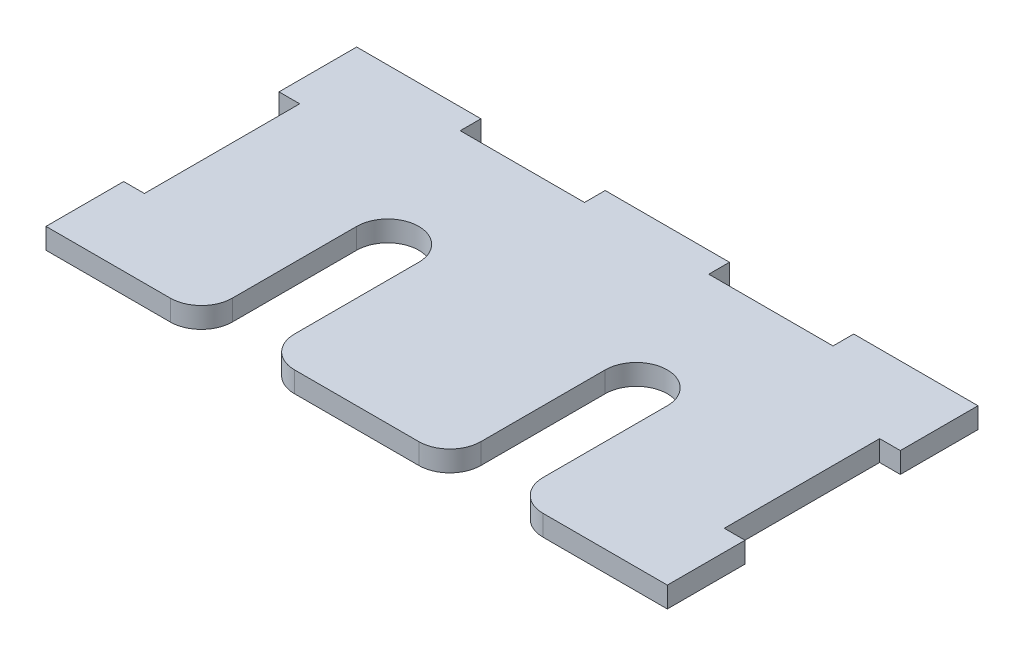
ISO-10303-21;
HEADER;
FILE_DESCRIPTION(('STEP AP214'),'2;1');
FILE_NAME('part.step','',(''),(''),'','','');
FILE_SCHEMA(('AUTOMOTIVE_DESIGN { 1 0 10303 214 1 1 1 1 }'));
ENDSEC;
DATA;
#1=APPLICATION_CONTEXT('core data for automotive mechanical design processes');
#2=APPLICATION_PROTOCOL_DEFINITION('international standard','automotive_design',2000,#1);
#3=PRODUCT_CONTEXT('',#1,'mechanical');
#4=PRODUCT('Part','Part','',(#3));
#5=PRODUCT_RELATED_PRODUCT_CATEGORY('part','',(#4));
#6=PRODUCT_DEFINITION_FORMATION('','',#4);
#7=PRODUCT_DEFINITION_CONTEXT('part definition',#1,'design');
#8=PRODUCT_DEFINITION('design','',#6,#7);
#9=PRODUCT_DEFINITION_SHAPE('','',#8);
#10=(LENGTH_UNIT() NAMED_UNIT(*) SI_UNIT(.MILLI.,.METRE.));
#11=(NAMED_UNIT(*) PLANE_ANGLE_UNIT() SI_UNIT($,.RADIAN.));
#12=(NAMED_UNIT(*) SI_UNIT($,.STERADIAN.) SOLID_ANGLE_UNIT());
#13=UNCERTAINTY_MEASURE_WITH_UNIT(LENGTH_MEASURE(1.E-05),#10,'distance_accuracy_value','');
#14=(GEOMETRIC_REPRESENTATION_CONTEXT(3) GLOBAL_UNCERTAINTY_ASSIGNED_CONTEXT((#13)) GLOBAL_UNIT_ASSIGNED_CONTEXT((#10,
#11,#12)) REPRESENTATION_CONTEXT('',''));
#15=CARTESIAN_POINT('',(0.,0.,0.));
#16=DIRECTION('',(0.,0.,1.));
#17=DIRECTION('',(1.,0.,0.));
#18=AXIS2_PLACEMENT_3D('',#15,#16,#17);
#19=CARTESIAN_POINT('',(45.,3.,22.5));
#20=DIRECTION('',(-1.,0.,0.));
#21=DIRECTION('',(0.,0.,1.));
#22=AXIS2_PLACEMENT_3D('',#19,#20,#21);
#23=PLANE('',#22);
#24=DIRECTION('',(0.,0.,-1.));
#25=VECTOR('',#24,1.);
#26=CARTESIAN_POINT('',(45.,0.,22.5));
#27=LINE('',#26,#25);
#28=CARTESIAN_POINT('',(45.,0.,22.5));
#29=VERTEX_POINT('',#28);
#30=CARTESIAN_POINT('',(45.,0.,11.25));
#31=VERTEX_POINT('',#30);
#32=EDGE_CURVE('E414',#29,#31,#27,.T.);
#33=ORIENTED_EDGE('',*,*,#32,.T.);
#34=DIRECTION('',(0.,1.,0.));
#35=VECTOR('',#34,1.);
#36=CARTESIAN_POINT('',(45.,0.,11.25));
#37=LINE('',#36,#35);
#38=CARTESIAN_POINT('',(45.,3.,11.25));
#39=VERTEX_POINT('',#38);
#40=EDGE_CURVE('E291',#31,#39,#37,.T.);
#41=ORIENTED_EDGE('',*,*,#40,.T.);
#42=DIRECTION('',(0.,0.,-1.));
#43=VECTOR('',#42,1.);
#44=CARTESIAN_POINT('',(45.,3.,22.5));
#45=LINE('',#44,#43);
#46=CARTESIAN_POINT('',(45.,3.,22.5));
#47=VERTEX_POINT('',#46);
#48=EDGE_CURVE('E395',#47,#39,#45,.T.);
#49=ORIENTED_EDGE('',*,*,#48,.F.);
#50=DIRECTION('',(0.,-1.,0.));
#51=VECTOR('',#50,1.);
#52=CARTESIAN_POINT('',(45.,3.,22.5));
#53=LINE('',#52,#51);
#54=EDGE_CURVE('E412',#47,#29,#53,.T.);
#55=ORIENTED_EDGE('',*,*,#54,.T.);
#56=EDGE_LOOP('',(#33,#41,#49,#55));
#57=FACE_BOUND('',#56,.T.);
#58=ADVANCED_FACE('F33',(#57),#23,.F.);
#59=CARTESIAN_POINT('',(-45.,3.,-22.5));
#60=DIRECTION('',(0.,0.,1.));
#61=DIRECTION('',(1.,0.,0.));
#62=AXIS2_PLACEMENT_3D('',#59,#60,#61);
#63=PLANE('',#62);
#64=DIRECTION('',(-1.,0.,0.));
#65=VECTOR('',#64,1.);
#66=CARTESIAN_POINT('',(-45.,3.,-22.5));
#67=LINE('',#66,#65);
#68=CARTESIAN_POINT('',(-27.,3.,-22.5));
#69=VERTEX_POINT('',#68);
#70=CARTESIAN_POINT('',(-45.,3.,-22.5));
#71=VERTEX_POINT('',#70);
#72=EDGE_CURVE('E398',#69,#71,#67,.T.);
#73=ORIENTED_EDGE('',*,*,#72,.F.);
#74=DIRECTION('',(0.,1.,0.));
#75=VECTOR('',#74,1.);
#76=CARTESIAN_POINT('',(-27.,0.,-22.5));
#77=LINE('',#76,#75);
#78=CARTESIAN_POINT('',(-27.,0.,-22.5));
#79=VERTEX_POINT('',#78);
#80=EDGE_CURVE('E271',#79,#69,#77,.T.);
#81=ORIENTED_EDGE('',*,*,#80,.F.);
#82=DIRECTION('',(-1.,0.,0.));
#83=VECTOR('',#82,1.);
#84=CARTESIAN_POINT('',(-45.,0.,-22.5));
#85=LINE('',#84,#83);
#86=CARTESIAN_POINT('',(-45.,0.,-22.5));
#87=VERTEX_POINT('',#86);
#88=EDGE_CURVE('E261',#79,#87,#85,.T.);
#89=ORIENTED_EDGE('',*,*,#88,.T.);
#90=DIRECTION('',(0.,-1.,0.));
#91=VECTOR('',#90,1.);
#92=CARTESIAN_POINT('',(-45.,3.,-22.5));
#93=LINE('',#92,#91);
#94=EDGE_CURVE('E435',#71,#87,#93,.T.);
#95=ORIENTED_EDGE('',*,*,#94,.F.);
#96=EDGE_LOOP('',(#73,#81,#89,#95));
#97=FACE_BOUND('',#96,.T.);
#98=ADVANCED_FACE('F554',(#97),#63,.F.);
#99=CARTESIAN_POINT('',(9.00000000000002,0.,-22.5));
#100=VERTEX_POINT('',#99);
#101=CARTESIAN_POINT('',(-8.99999999999998,0.,-22.5));
#102=VERTEX_POINT('',#101);
#103=EDGE_CURVE('E421',#100,#102,#85,.T.);
#104=ORIENTED_EDGE('',*,*,#103,.T.);
#105=DIRECTION('',(0.,1.,0.));
#106=VECTOR('',#105,1.);
#107=CARTESIAN_POINT('',(-8.99999999999998,0.,-22.5));
#108=LINE('',#107,#106);
#109=CARTESIAN_POINT('',(-8.99999999999998,3.,-22.5));
#110=VERTEX_POINT('',#109);
#111=EDGE_CURVE('E274',#102,#110,#108,.T.);
#112=ORIENTED_EDGE('',*,*,#111,.T.);
#113=CARTESIAN_POINT('',(9.00000000000002,3.,-22.5));
#114=VERTEX_POINT('',#113);
#115=EDGE_CURVE('E404',#114,#110,#67,.T.);
#116=ORIENTED_EDGE('',*,*,#115,.F.);
#117=DIRECTION('',(0.,1.,0.));
#118=VECTOR('',#117,1.);
#119=CARTESIAN_POINT('',(9.00000000000002,0.,-22.5));
#120=LINE('',#119,#118);
#121=EDGE_CURVE('E269',#100,#114,#120,.T.);
#122=ORIENTED_EDGE('',*,*,#121,.F.);
#123=EDGE_LOOP('',(#104,#112,#116,#122));
#124=FACE_BOUND('',#123,.T.);
#125=ADVANCED_FACE('F559',(#124),#63,.F.);
#126=CARTESIAN_POINT('',(-45.,3.,22.5));
#127=DIRECTION('',(1.,0.,0.));
#128=DIRECTION('',(0.,0.,-1.));
#129=AXIS2_PLACEMENT_3D('',#126,#127,#128);
#130=PLANE('',#129);
#131=DIRECTION('',(0.,0.,1.));
#132=VECTOR('',#131,1.);
#133=CARTESIAN_POINT('',(-45.,0.,22.5));
#134=LINE('',#133,#132);
#135=CARTESIAN_POINT('',(-45.,0.,-11.25));
#136=VERTEX_POINT('',#135);
#137=EDGE_CURVE('E422',#87,#136,#134,.T.);
#138=ORIENTED_EDGE('',*,*,#137,.T.);
#139=DIRECTION('',(0.,1.,0.));
#140=VECTOR('',#139,1.);
#141=CARTESIAN_POINT('',(-45.,0.,-11.25));
#142=LINE('',#141,#140);
#143=CARTESIAN_POINT('',(-45.,3.,-11.25));
#144=VERTEX_POINT('',#143);
#145=EDGE_CURVE('E344',#136,#144,#142,.T.);
#146=ORIENTED_EDGE('',*,*,#145,.T.);
#147=DIRECTION('',(0.,0.,1.));
#148=VECTOR('',#147,1.);
#149=CARTESIAN_POINT('',(-45.,3.,22.5));
#150=LINE('',#149,#148);
#151=EDGE_CURVE('E405',#71,#144,#150,.T.);
#152=ORIENTED_EDGE('',*,*,#151,.F.);
#153=ORIENTED_EDGE('',*,*,#94,.T.);
#154=EDGE_LOOP('',(#138,#146,#152,#153));
#155=FACE_BOUND('',#154,.T.);
#156=ADVANCED_FACE('F549',(#155),#130,.F.);
#157=CARTESIAN_POINT('',(-45.,3.,22.5));
#158=DIRECTION('',(0.,0.,-1.));
#159=DIRECTION('',(-1.,0.,0.));
#160=AXIS2_PLACEMENT_3D('',#157,#158,#159);
#161=PLANE('',#160);
#162=DIRECTION('',(1.,0.,0.));
#163=VECTOR('',#162,1.);
#164=CARTESIAN_POINT('',(-45.,3.,22.5));
#165=LINE('',#164,#163);
#166=CARTESIAN_POINT('',(-8.99999999999999,3.,22.5));
#167=VERTEX_POINT('',#166);
#168=CARTESIAN_POINT('',(9.00000000000001,3.,22.5));
#169=VERTEX_POINT('',#168);
#170=EDGE_CURVE('E413',#167,#169,#165,.T.);
#171=ORIENTED_EDGE('',*,*,#170,.F.);
#172=DIRECTION('',(0.,1.,0.));
#173=VECTOR('',#172,1.);
#174=CARTESIAN_POINT('',(-8.99999999999997,3.,22.5));
#175=LINE('',#174,#173);
#176=CARTESIAN_POINT('',(-8.99999999999999,0.,22.5));
#177=VERTEX_POINT('',#176);
#178=EDGE_CURVE('E468',#167,#177,#175,.F.);
#179=ORIENTED_EDGE('',*,*,#178,.T.);
#180=DIRECTION('',(1.,0.,0.));
#181=VECTOR('',#180,1.);
#182=CARTESIAN_POINT('',(-45.,0.,22.5));
#183=LINE('',#182,#181);
#184=CARTESIAN_POINT('',(9.00000000000001,0.,22.5));
#185=VERTEX_POINT('',#184);
#186=EDGE_CURVE('E429',#177,#185,#183,.T.);
#187=ORIENTED_EDGE('',*,*,#186,.T.);
#188=DIRECTION('',(0.,1.,0.));
#189=VECTOR('',#188,1.);
#190=CARTESIAN_POINT('',(9.00000000000002,3.,22.5));
#191=LINE('',#190,#189);
#192=EDGE_CURVE('E465',#185,#169,#191,.T.);
#193=ORIENTED_EDGE('',*,*,#192,.T.);
#194=EDGE_LOOP('',(#171,#179,#187,#193));
#195=FACE_BOUND('',#194,.T.);
#196=ADVANCED_FACE('F502',(#195),#161,.F.);
#197=CARTESIAN_POINT('',(-45.,0.,22.5));
#198=VERTEX_POINT('',#197);
#199=CARTESIAN_POINT('',(-27.,0.,22.5));
#200=VERTEX_POINT('',#199);
#201=EDGE_CURVE('E426',#198,#200,#183,.T.);
#202=ORIENTED_EDGE('',*,*,#201,.T.);
#203=DIRECTION('',(0.,1.,0.));
#204=VECTOR('',#203,1.);
#205=CARTESIAN_POINT('',(-27.,3.,22.5));
#206=LINE('',#205,#204);
#207=CARTESIAN_POINT('',(-27.,3.,22.5));
#208=VERTEX_POINT('',#207);
#209=EDGE_CURVE('E441',#200,#208,#206,.T.);
#210=ORIENTED_EDGE('',*,*,#209,.T.);
#211=CARTESIAN_POINT('',(-45.,3.,22.5));
#212=VERTEX_POINT('',#211);
#213=EDGE_CURVE('E409',#212,#208,#165,.T.);
#214=ORIENTED_EDGE('',*,*,#213,.F.);
#215=DIRECTION('',(0.,-1.,0.));
#216=VECTOR('',#215,1.);
#217=CARTESIAN_POINT('',(-45.,3.,22.5));
#218=LINE('',#217,#216);
#219=EDGE_CURVE('E432',#212,#198,#218,.T.);
#220=ORIENTED_EDGE('',*,*,#219,.T.);
#221=EDGE_LOOP('',(#202,#210,#214,#220));
#222=FACE_BOUND('',#221,.T.);
#223=ADVANCED_FACE('F530',(#222),#161,.F.);
#224=CARTESIAN_POINT('',(45.,3.,-11.25));
#225=VERTEX_POINT('',#224);
#226=CARTESIAN_POINT('',(45.,3.,-22.5));
#227=VERTEX_POINT('',#226);
#228=EDGE_CURVE('E399',#225,#227,#45,.T.);
#229=ORIENTED_EDGE('',*,*,#228,.F.);
#230=DIRECTION('',(0.,1.,0.));
#231=VECTOR('',#230,1.);
#232=CARTESIAN_POINT('',(45.,0.,-11.25));
#233=LINE('',#232,#231);
#234=CARTESIAN_POINT('',(45.,0.,-11.25));
#235=VERTEX_POINT('',#234);
#236=EDGE_CURVE('E312',#235,#225,#233,.T.);
#237=ORIENTED_EDGE('',*,*,#236,.F.);
#238=CARTESIAN_POINT('',(45.,0.,-22.5));
#239=VERTEX_POINT('',#238);
#240=EDGE_CURVE('E392',#235,#239,#27,.T.);
#241=ORIENTED_EDGE('',*,*,#240,.T.);
#242=DIRECTION('',(0.,-1.,0.));
#243=VECTOR('',#242,1.);
#244=CARTESIAN_POINT('',(45.,3.,-22.5));
#245=LINE('',#244,#243);
#246=EDGE_CURVE('E438',#227,#239,#245,.T.);
#247=ORIENTED_EDGE('',*,*,#246,.F.);
#248=EDGE_LOOP('',(#229,#237,#241,#247));
#249=FACE_BOUND('',#248,.T.);
#250=ADVANCED_FACE('F581',(#249),#23,.F.);
#251=CARTESIAN_POINT('',(27.,0.,-22.5));
#252=VERTEX_POINT('',#251);
#253=EDGE_CURVE('E417',#239,#252,#85,.T.);
#254=ORIENTED_EDGE('',*,*,#253,.T.);
#255=DIRECTION('',(0.,1.,0.));
#256=VECTOR('',#255,1.);
#257=CARTESIAN_POINT('',(27.,0.,-22.5));
#258=LINE('',#257,#256);
#259=CARTESIAN_POINT('',(27.,3.,-22.5));
#260=VERTEX_POINT('',#259);
#261=EDGE_CURVE('E296',#252,#260,#258,.T.);
#262=ORIENTED_EDGE('',*,*,#261,.T.);
#263=EDGE_CURVE('E400',#227,#260,#67,.T.);
#264=ORIENTED_EDGE('',*,*,#263,.F.);
#265=ORIENTED_EDGE('',*,*,#246,.T.);
#266=EDGE_LOOP('',(#254,#262,#264,#265));
#267=FACE_BOUND('',#266,.T.);
#268=ADVANCED_FACE('F573',(#267),#63,.F.);
#269=CARTESIAN_POINT('',(-45.,3.,11.25));
#270=VERTEX_POINT('',#269);
#271=EDGE_CURVE('E403',#270,#212,#150,.T.);
#272=ORIENTED_EDGE('',*,*,#271,.F.);
#273=DIRECTION('',(0.,1.,0.));
#274=VECTOR('',#273,1.);
#275=CARTESIAN_POINT('',(-45.,0.,11.25));
#276=LINE('',#275,#274);
#277=CARTESIAN_POINT('',(-45.,0.,11.25));
#278=VERTEX_POINT('',#277);
#279=EDGE_CURVE('E337',#278,#270,#276,.T.);
#280=ORIENTED_EDGE('',*,*,#279,.F.);
#281=EDGE_CURVE('E420',#278,#198,#134,.T.);
#282=ORIENTED_EDGE('',*,*,#281,.T.);
#283=ORIENTED_EDGE('',*,*,#219,.F.);
#284=EDGE_LOOP('',(#272,#280,#282,#283));
#285=FACE_BOUND('',#284,.T.);
#286=ADVANCED_FACE('F535',(#285),#130,.F.);
#287=CARTESIAN_POINT('',(27.,3.,22.5));
#288=VERTEX_POINT('',#287);
#289=EDGE_CURVE('E408',#288,#47,#165,.T.);
#290=ORIENTED_EDGE('',*,*,#289,.F.);
#291=DIRECTION('',(0.,1.,0.));
#292=VECTOR('',#291,1.);
#293=CARTESIAN_POINT('',(27.,3.,22.5));
#294=LINE('',#293,#292);
#295=CARTESIAN_POINT('',(27.,0.,22.5));
#296=VERTEX_POINT('',#295);
#297=EDGE_CURVE('E11',#288,#296,#294,.F.);
#298=ORIENTED_EDGE('',*,*,#297,.T.);
#299=EDGE_CURVE('E425',#296,#29,#183,.T.);
#300=ORIENTED_EDGE('',*,*,#299,.T.);
#301=ORIENTED_EDGE('',*,*,#54,.F.);
#302=EDGE_LOOP('',(#290,#298,#300,#301));
#303=FACE_BOUND('',#302,.T.);
#304=ADVANCED_FACE('F494',(#303),#161,.F.);
#305=CARTESIAN_POINT('',(0.,3.,0.));
#306=DIRECTION('',(0.,-1.,0.));
#307=DIRECTION('',(0.,0.,-1.));
#308=AXIS2_PLACEMENT_3D('',#305,#306,#307);
#309=PLANE('',#308);
#310=DIRECTION('',(1.,0.,0.));
#311=VECTOR('',#310,1.);
#312=CARTESIAN_POINT('',(-27.,3.,-19.5));
#313=LINE('',#312,#311);
#314=CARTESIAN_POINT('',(-27.,3.,-19.5));
#315=VERTEX_POINT('',#314);
#316=CARTESIAN_POINT('',(-8.99999999999998,3.,-19.5));
#317=VERTEX_POINT('',#316);
#318=EDGE_CURVE('E264',#315,#317,#313,.T.);
#319=ORIENTED_EDGE('',*,*,#318,.F.);
#320=DIRECTION('',(0.,0.,1.));
#321=VECTOR('',#320,1.);
#322=CARTESIAN_POINT('',(-27.,3.,-22.5));
#323=LINE('',#322,#321);
#324=EDGE_CURVE('E247',#69,#315,#323,.T.);
#325=ORIENTED_EDGE('',*,*,#324,.F.);
#326=ORIENTED_EDGE('',*,*,#72,.T.);
#327=ORIENTED_EDGE('',*,*,#151,.T.);
#328=DIRECTION('',(-1.,0.,0.));
#329=VECTOR('',#328,1.);
#330=CARTESIAN_POINT('',(-45.,3.,-11.25));
#331=LINE('',#330,#329);
#332=CARTESIAN_POINT('',(-42.,3.,-11.25));
#333=VERTEX_POINT('',#332);
#334=EDGE_CURVE('E331',#333,#144,#331,.T.);
#335=ORIENTED_EDGE('',*,*,#334,.F.);
#336=DIRECTION('',(0.,0.,-1.));
#337=VECTOR('',#336,1.);
#338=CARTESIAN_POINT('',(-42.,3.,-11.25));
#339=LINE('',#338,#337);
#340=CARTESIAN_POINT('',(-42.,3.,11.25));
#341=VERTEX_POINT('',#340);
#342=EDGE_CURVE('E340',#341,#333,#339,.T.);
#343=ORIENTED_EDGE('',*,*,#342,.F.);
#344=DIRECTION('',(1.,0.,0.));
#345=VECTOR('',#344,1.);
#346=CARTESIAN_POINT('',(-45.,3.,11.25));
#347=LINE('',#346,#345);
#348=EDGE_CURVE('E273',#270,#341,#347,.T.);
#349=ORIENTED_EDGE('',*,*,#348,.F.);
#350=ORIENTED_EDGE('',*,*,#271,.T.);
#351=ORIENTED_EDGE('',*,*,#213,.T.);
#352=CARTESIAN_POINT('',(-27.,3.,18.));
#353=DIRECTION('',(0.,-1.,0.));
#354=DIRECTION('',(0.,0.,-1.));
#355=AXIS2_PLACEMENT_3D('',#352,#353,#354);
#356=CIRCLE('',#355,4.5);
#357=CARTESIAN_POINT('',(-22.5,3.,18.));
#358=VERTEX_POINT('',#357);
#359=EDGE_CURVE('E450',#208,#358,#356,.F.);
#360=ORIENTED_EDGE('',*,*,#359,.T.);
#361=DIRECTION('',(0.,0.,1.));
#362=VECTOR('',#361,1.);
#363=CARTESIAN_POINT('',(-22.5,3.,22.5));
#364=LINE('',#363,#362);
#365=CARTESIAN_POINT('',(-22.5,3.,0.));
#366=VERTEX_POINT('',#365);
#367=EDGE_CURVE('E371',#366,#358,#364,.T.);
#368=ORIENTED_EDGE('',*,*,#367,.F.);
#369=CARTESIAN_POINT('',(-18.,3.,0.));
#370=DIRECTION('',(0.,1.,0.));
#371=DIRECTION('',(0.,0.,-1.));
#372=AXIS2_PLACEMENT_3D('',#369,#370,#371);
#373=CIRCLE('',#372,4.5);
#374=CARTESIAN_POINT('',(-13.5,3.,0.));
#375=VERTEX_POINT('',#374);
#376=EDGE_CURVE('E378',#375,#366,#373,.T.);
#377=ORIENTED_EDGE('',*,*,#376,.F.);
#378=DIRECTION('',(0.,0.,-1.));
#379=VECTOR('',#378,1.);
#380=CARTESIAN_POINT('',(-13.5,3.,22.5));
#381=LINE('',#380,#379);
#382=CARTESIAN_POINT('',(-13.5,3.,18.));
#383=VERTEX_POINT('',#382);
#384=EDGE_CURVE('E386',#383,#375,#381,.T.);
#385=ORIENTED_EDGE('',*,*,#384,.F.);
#386=CARTESIAN_POINT('',(-8.99999999999997,3.,18.));
#387=DIRECTION('',(0.,-1.,0.));
#388=DIRECTION('',(0.,0.,-1.));
#389=AXIS2_PLACEMENT_3D('',#386,#387,#388);
#390=CIRCLE('',#389,4.5);
#391=EDGE_CURVE('E448',#383,#167,#390,.F.);
#392=ORIENTED_EDGE('',*,*,#391,.T.);
#393=ORIENTED_EDGE('',*,*,#170,.T.);
#394=CARTESIAN_POINT('',(9.00000000000002,3.,18.));
#395=DIRECTION('',(0.,-1.,0.));
#396=DIRECTION('',(0.,0.,-1.));
#397=AXIS2_PLACEMENT_3D('',#394,#395,#396);
#398=CIRCLE('',#397,4.5);
#399=CARTESIAN_POINT('',(13.5,3.,18.));
#400=VERTEX_POINT('',#399);
#401=EDGE_CURVE('E446',#169,#400,#398,.F.);
#402=ORIENTED_EDGE('',*,*,#401,.T.);
#403=DIRECTION('',(0.,0.,1.));
#404=VECTOR('',#403,1.);
#405=CARTESIAN_POINT('',(13.5,3.,22.5));
#406=LINE('',#405,#404);
#407=CARTESIAN_POINT('',(13.5,3.,0.));
#408=VERTEX_POINT('',#407);
#409=EDGE_CURVE('E347',#408,#400,#406,.T.);
#410=ORIENTED_EDGE('',*,*,#409,.F.);
#411=CARTESIAN_POINT('',(18.,3.,0.));
#412=DIRECTION('',(0.,1.,0.));
#413=DIRECTION('',(0.,0.,-1.));
#414=AXIS2_PLACEMENT_3D('',#411,#412,#413);
#415=CIRCLE('',#414,4.5);
#416=CARTESIAN_POINT('',(22.5,3.,0.));
#417=VERTEX_POINT('',#416);
#418=EDGE_CURVE('E357',#417,#408,#415,.T.);
#419=ORIENTED_EDGE('',*,*,#418,.F.);
#420=DIRECTION('',(0.,0.,-1.));
#421=VECTOR('',#420,1.);
#422=CARTESIAN_POINT('',(22.5,3.,22.5));
#423=LINE('',#422,#421);
#424=CARTESIAN_POINT('',(22.5,3.,18.));
#425=VERTEX_POINT('',#424);
#426=EDGE_CURVE('E365',#425,#417,#423,.T.);
#427=ORIENTED_EDGE('',*,*,#426,.F.);
#428=CARTESIAN_POINT('',(27.,3.,18.));
#429=DIRECTION('',(0.,-1.,0.));
#430=DIRECTION('',(0.,0.,-1.));
#431=AXIS2_PLACEMENT_3D('',#428,#429,#430);
#432=CIRCLE('',#431,4.5);
#433=EDGE_CURVE('E444',#425,#288,#432,.F.);
#434=ORIENTED_EDGE('',*,*,#433,.T.);
#435=ORIENTED_EDGE('',*,*,#289,.T.);
#436=ORIENTED_EDGE('',*,*,#48,.T.);
#437=DIRECTION('',(1.,0.,0.));
#438=VECTOR('',#437,1.);
#439=CARTESIAN_POINT('',(45.,3.,11.25));
#440=LINE('',#439,#438);
#441=CARTESIAN_POINT('',(42.,3.,11.25));
#442=VERTEX_POINT('',#441);
#443=EDGE_CURVE('E306',#442,#39,#440,.T.);
#444=ORIENTED_EDGE('',*,*,#443,.F.);
#445=DIRECTION('',(0.,0.,1.));
#446=VECTOR('',#445,1.);
#447=CARTESIAN_POINT('',(42.,3.,-11.25));
#448=LINE('',#447,#446);
#449=CARTESIAN_POINT('',(42.,3.,-11.25));
#450=VERTEX_POINT('',#449);
#451=EDGE_CURVE('E316',#450,#442,#448,.T.);
#452=ORIENTED_EDGE('',*,*,#451,.F.);
#453=DIRECTION('',(-1.,0.,0.));
#454=VECTOR('',#453,1.);
#455=CARTESIAN_POINT('',(45.,3.,-11.25));
#456=LINE('',#455,#454);
#457=EDGE_CURVE('E313',#225,#450,#456,.T.);
#458=ORIENTED_EDGE('',*,*,#457,.F.);
#459=ORIENTED_EDGE('',*,*,#228,.T.);
#460=ORIENTED_EDGE('',*,*,#263,.T.);
#461=DIRECTION('',(0.,0.,-1.));
#462=VECTOR('',#461,1.);
#463=CARTESIAN_POINT('',(27.,3.,-22.5));
#464=LINE('',#463,#462);
#465=CARTESIAN_POINT('',(27.,3.,-19.5));
#466=VERTEX_POINT('',#465);
#467=EDGE_CURVE('E282',#466,#260,#464,.T.);
#468=ORIENTED_EDGE('',*,*,#467,.F.);
#469=DIRECTION('',(1.,0.,0.));
#470=VECTOR('',#469,1.);
#471=CARTESIAN_POINT('',(9.00000000000002,3.,-19.5));
#472=LINE('',#471,#470);
#473=CARTESIAN_POINT('',(9.00000000000002,3.,-19.5));
#474=VERTEX_POINT('',#473);
#475=EDGE_CURVE('E290',#474,#466,#472,.T.);
#476=ORIENTED_EDGE('',*,*,#475,.F.);
#477=DIRECTION('',(0.,0.,1.));
#478=VECTOR('',#477,1.);
#479=CARTESIAN_POINT('',(9.00000000000002,3.,-22.5));
#480=LINE('',#479,#478);
#481=EDGE_CURVE('E287',#114,#474,#480,.T.);
#482=ORIENTED_EDGE('',*,*,#481,.F.);
#483=ORIENTED_EDGE('',*,*,#115,.T.);
#484=DIRECTION('',(0.,0.,-1.));
#485=VECTOR('',#484,1.);
#486=CARTESIAN_POINT('',(-8.99999999999998,3.,-22.5));
#487=LINE('',#486,#485);
#488=EDGE_CURVE('E262',#317,#110,#487,.T.);
#489=ORIENTED_EDGE('',*,*,#488,.F.);
#490=EDGE_LOOP('',(#319,#325,#326,#327,#335,#343,#349,#350,#351,#360,#368,#377,#385,#392,#393,
#402,#410,#419,#427,#434,#435,#436,#444,#452,#458,#459,#460,#468,#476,#482,#483,#489));
#491=FACE_BOUND('',#490,.T.);
#492=ADVANCED_FACE('F482',(#491),#309,.F.);
#493=CARTESIAN_POINT('',(0.,0.,0.));
#494=DIRECTION('',(0.,-1.,0.));
#495=DIRECTION('',(0.,0.,-1.));
#496=AXIS2_PLACEMENT_3D('',#493,#494,#495);
#497=PLANE('',#496);
#498=DIRECTION('',(0.,0.,1.));
#499=VECTOR('',#498,1.);
#500=CARTESIAN_POINT('',(-27.,0.,-22.5));
#501=LINE('',#500,#499);
#502=CARTESIAN_POINT('',(-27.,0.,-19.5));
#503=VERTEX_POINT('',#502);
#504=EDGE_CURVE('E244',#79,#503,#501,.T.);
#505=ORIENTED_EDGE('',*,*,#504,.T.);
#506=DIRECTION('',(1.,0.,0.));
#507=VECTOR('',#506,1.);
#508=CARTESIAN_POINT('',(-27.,0.,-19.5));
#509=LINE('',#508,#507);
#510=CARTESIAN_POINT('',(-8.99999999999998,0.,-19.5));
#511=VERTEX_POINT('',#510);
#512=EDGE_CURVE('E254',#503,#511,#509,.T.);
#513=ORIENTED_EDGE('',*,*,#512,.T.);
#514=DIRECTION('',(0.,0.,-1.));
#515=VECTOR('',#514,1.);
#516=CARTESIAN_POINT('',(-8.99999999999998,0.,-22.5));
#517=LINE('',#516,#515);
#518=EDGE_CURVE('E48',#511,#102,#517,.T.);
#519=ORIENTED_EDGE('',*,*,#518,.T.);
#520=ORIENTED_EDGE('',*,*,#103,.F.);
#521=DIRECTION('',(0.,0.,1.));
#522=VECTOR('',#521,1.);
#523=CARTESIAN_POINT('',(9.00000000000002,0.,-22.5));
#524=LINE('',#523,#522);
#525=CARTESIAN_POINT('',(9.00000000000002,0.,-19.5));
#526=VERTEX_POINT('',#525);
#527=EDGE_CURVE('E278',#100,#526,#524,.T.);
#528=ORIENTED_EDGE('',*,*,#527,.T.);
#529=DIRECTION('',(1.,0.,0.));
#530=VECTOR('',#529,1.);
#531=CARTESIAN_POINT('',(9.00000000000002,0.,-19.5));
#532=LINE('',#531,#530);
#533=CARTESIAN_POINT('',(27.,0.,-19.5));
#534=VERTEX_POINT('',#533);
#535=EDGE_CURVE('E281',#526,#534,#532,.T.);
#536=ORIENTED_EDGE('',*,*,#535,.T.);
#537=DIRECTION('',(0.,0.,-1.));
#538=VECTOR('',#537,1.);
#539=CARTESIAN_POINT('',(27.,0.,-22.5));
#540=LINE('',#539,#538);
#541=EDGE_CURVE('E56',#534,#252,#540,.T.);
#542=ORIENTED_EDGE('',*,*,#541,.T.);
#543=ORIENTED_EDGE('',*,*,#253,.F.);
#544=ORIENTED_EDGE('',*,*,#240,.F.);
#545=DIRECTION('',(-1.,0.,0.));
#546=VECTOR('',#545,1.);
#547=CARTESIAN_POINT('',(45.,0.,-11.25));
#548=LINE('',#547,#546);
#549=CARTESIAN_POINT('',(42.,0.,-11.25));
#550=VERTEX_POINT('',#549);
#551=EDGE_CURVE('E302',#235,#550,#548,.T.);
#552=ORIENTED_EDGE('',*,*,#551,.T.);
#553=DIRECTION('',(0.,0.,1.));
#554=VECTOR('',#553,1.);
#555=CARTESIAN_POINT('',(42.,0.,-11.25));
#556=LINE('',#555,#554);
#557=CARTESIAN_POINT('',(42.,0.,11.25));
#558=VERTEX_POINT('',#557);
#559=EDGE_CURVE('E305',#550,#558,#556,.T.);
#560=ORIENTED_EDGE('',*,*,#559,.T.);
#561=DIRECTION('',(1.,0.,0.));
#562=VECTOR('',#561,1.);
#563=CARTESIAN_POINT('',(45.,0.,11.25));
#564=LINE('',#563,#562);
#565=EDGE_CURVE('E309',#558,#31,#564,.T.);
#566=ORIENTED_EDGE('',*,*,#565,.T.);
#567=ORIENTED_EDGE('',*,*,#32,.F.);
#568=ORIENTED_EDGE('',*,*,#299,.F.);
#569=CARTESIAN_POINT('',(27.,0.,18.));
#570=DIRECTION('',(0.,-1.,0.));
#571=DIRECTION('',(0.,0.,-1.));
#572=AXIS2_PLACEMENT_3D('',#569,#570,#571);
#573=CIRCLE('',#572,4.5);
#574=CARTESIAN_POINT('',(22.5,0.,18.));
#575=VERTEX_POINT('',#574);
#576=EDGE_CURVE('E454',#296,#575,#573,.T.);
#577=ORIENTED_EDGE('',*,*,#576,.T.);
#578=DIRECTION('',(0.,0.,-1.));
#579=VECTOR('',#578,1.);
#580=CARTESIAN_POINT('',(22.5,0.,22.5));
#581=LINE('',#580,#579);
#582=CARTESIAN_POINT('',(22.5,0.,0.));
#583=VERTEX_POINT('',#582);
#584=EDGE_CURVE('E356',#575,#583,#581,.T.);
#585=ORIENTED_EDGE('',*,*,#584,.T.);
#586=CARTESIAN_POINT('',(18.,0.,0.));
#587=DIRECTION('',(0.,1.,0.));
#588=DIRECTION('',(0.,0.,-1.));
#589=AXIS2_PLACEMENT_3D('',#586,#587,#588);
#590=CIRCLE('',#589,4.5);
#591=CARTESIAN_POINT('',(13.5,0.,0.));
#592=VERTEX_POINT('',#591);
#593=EDGE_CURVE('E359',#583,#592,#590,.T.);
#594=ORIENTED_EDGE('',*,*,#593,.T.);
#595=DIRECTION('',(0.,0.,1.));
#596=VECTOR('',#595,1.);
#597=CARTESIAN_POINT('',(13.5,0.,22.5));
#598=LINE('',#597,#596);
#599=CARTESIAN_POINT('',(13.5,0.,18.));
#600=VERTEX_POINT('',#599);
#601=EDGE_CURVE('E353',#592,#600,#598,.T.);
#602=ORIENTED_EDGE('',*,*,#601,.T.);
#603=CARTESIAN_POINT('',(9.00000000000002,0.,18.));
#604=DIRECTION('',(0.,-1.,0.));
#605=DIRECTION('',(0.,0.,-1.));
#606=AXIS2_PLACEMENT_3D('',#603,#604,#605);
#607=CIRCLE('',#606,4.5);
#608=EDGE_CURVE('E456',#600,#185,#607,.T.);
#609=ORIENTED_EDGE('',*,*,#608,.T.);
#610=ORIENTED_EDGE('',*,*,#186,.F.);
#611=CARTESIAN_POINT('',(-8.99999999999997,0.,18.));
#612=DIRECTION('',(0.,-1.,0.));
#613=DIRECTION('',(0.,0.,-1.));
#614=AXIS2_PLACEMENT_3D('',#611,#612,#613);
#615=CIRCLE('',#614,4.5);
#616=CARTESIAN_POINT('',(-13.5,0.,18.));
#617=VERTEX_POINT('',#616);
#618=EDGE_CURVE('E458',#177,#617,#615,.T.);
#619=ORIENTED_EDGE('',*,*,#618,.T.);
#620=DIRECTION('',(0.,0.,-1.));
#621=VECTOR('',#620,1.);
#622=CARTESIAN_POINT('',(-13.5,0.,22.5));
#623=LINE('',#622,#621);
#624=CARTESIAN_POINT('',(-13.5,0.,0.));
#625=VERTEX_POINT('',#624);
#626=EDGE_CURVE('E377',#617,#625,#623,.T.);
#627=ORIENTED_EDGE('',*,*,#626,.T.);
#628=CARTESIAN_POINT('',(-18.,0.,0.));
#629=DIRECTION('',(0.,1.,0.));
#630=DIRECTION('',(0.,0.,-1.));
#631=AXIS2_PLACEMENT_3D('',#628,#629,#630);
#632=CIRCLE('',#631,4.5);
#633=CARTESIAN_POINT('',(-22.5,0.,0.));
#634=VERTEX_POINT('',#633);
#635=EDGE_CURVE('E380',#625,#634,#632,.T.);
#636=ORIENTED_EDGE('',*,*,#635,.T.);
#637=DIRECTION('',(0.,0.,1.));
#638=VECTOR('',#637,1.);
#639=CARTESIAN_POINT('',(-22.5,0.,22.5));
#640=LINE('',#639,#638);
#641=CARTESIAN_POINT('',(-22.5,0.,18.));
#642=VERTEX_POINT('',#641);
#643=EDGE_CURVE('E374',#634,#642,#640,.T.);
#644=ORIENTED_EDGE('',*,*,#643,.T.);
#645=CARTESIAN_POINT('',(-27.,0.,18.));
#646=DIRECTION('',(0.,-1.,0.));
#647=DIRECTION('',(0.,0.,-1.));
#648=AXIS2_PLACEMENT_3D('',#645,#646,#647);
#649=CIRCLE('',#648,4.5);
#650=EDGE_CURVE('E460',#642,#200,#649,.T.);
#651=ORIENTED_EDGE('',*,*,#650,.T.);
#652=ORIENTED_EDGE('',*,*,#201,.F.);
#653=ORIENTED_EDGE('',*,*,#281,.F.);
#654=DIRECTION('',(1.,0.,0.));
#655=VECTOR('',#654,1.);
#656=CARTESIAN_POINT('',(-45.,0.,11.25));
#657=LINE('',#656,#655);
#658=CARTESIAN_POINT('',(-42.,0.,11.25));
#659=VERTEX_POINT('',#658);
#660=EDGE_CURVE('E327',#278,#659,#657,.T.);
#661=ORIENTED_EDGE('',*,*,#660,.T.);
#662=DIRECTION('',(0.,0.,-1.));
#663=VECTOR('',#662,1.);
#664=CARTESIAN_POINT('',(-42.,0.,-11.25));
#665=LINE('',#664,#663);
#666=CARTESIAN_POINT('',(-42.,0.,-11.25));
#667=VERTEX_POINT('',#666);
#668=EDGE_CURVE('E330',#659,#667,#665,.T.);
#669=ORIENTED_EDGE('',*,*,#668,.T.);
#670=DIRECTION('',(-1.,0.,0.));
#671=VECTOR('',#670,1.);
#672=CARTESIAN_POINT('',(-45.,0.,-11.25));
#673=LINE('',#672,#671);
#674=EDGE_CURVE('E334',#667,#136,#673,.T.);
#675=ORIENTED_EDGE('',*,*,#674,.T.);
#676=ORIENTED_EDGE('',*,*,#137,.F.);
#677=ORIENTED_EDGE('',*,*,#88,.F.);
#678=EDGE_LOOP('',(#505,#513,#519,#520,#528,#536,#542,#543,#544,#552,#560,#566,#567,#568,#577,
#585,#594,#602,#609,#610,#619,#627,#636,#644,#651,#652,#653,#661,#669,#675,#676,#677));
#679=FACE_BOUND('',#678,.T.);
#680=ADVANCED_FACE('F259',(#679),#497,.T.);
#681=CARTESIAN_POINT('',(-22.5,0.,22.5));
#682=DIRECTION('',(-1.,0.,0.));
#683=DIRECTION('',(0.,0.,1.));
#684=AXIS2_PLACEMENT_3D('',#681,#682,#683);
#685=PLANE('',#684);
#686=ORIENTED_EDGE('',*,*,#367,.T.);
#687=DIRECTION('',(0.,1.,0.));
#688=VECTOR('',#687,1.);
#689=CARTESIAN_POINT('',(-22.5,0.,18.));
#690=LINE('',#689,#688);
#691=EDGE_CURVE('E452',#358,#642,#690,.F.);
#692=ORIENTED_EDGE('',*,*,#691,.T.);
#693=ORIENTED_EDGE('',*,*,#643,.F.);
#694=DIRECTION('',(0.,1.,0.));
#695=VECTOR('',#694,1.);
#696=CARTESIAN_POINT('',(-22.5,0.,0.));
#697=LINE('',#696,#695);
#698=EDGE_CURVE('E390',#634,#366,#697,.T.);
#699=ORIENTED_EDGE('',*,*,#698,.T.);
#700=EDGE_LOOP('',(#686,#692,#693,#699));
#701=FACE_BOUND('',#700,.T.);
#702=ADVANCED_FACE('F521',(#701),#685,.F.);
#703=CARTESIAN_POINT('',(-18.,0.,0.));
#704=DIRECTION('',(0.,1.,0.));
#705=DIRECTION('',(0.,0.,1.));
#706=AXIS2_PLACEMENT_3D('',#703,#704,#705);
#707=CYLINDRICAL_SURFACE('',#706,4.5);
#708=ORIENTED_EDGE('',*,*,#376,.T.);
#709=ORIENTED_EDGE('',*,*,#698,.F.);
#710=ORIENTED_EDGE('',*,*,#635,.F.);
#711=DIRECTION('',(0.,1.,0.));
#712=VECTOR('',#711,1.);
#713=CARTESIAN_POINT('',(-13.5,0.,0.));
#714=LINE('',#713,#712);
#715=EDGE_CURVE('E383',#625,#375,#714,.T.);
#716=ORIENTED_EDGE('',*,*,#715,.T.);
#717=EDGE_LOOP('',(#708,#709,#710,#716));
#718=FACE_BOUND('',#717,.T.);
#719=ADVANCED_FACE('F517',(#718),#707,.F.);
#720=CARTESIAN_POINT('',(-13.5,0.,22.5));
#721=DIRECTION('',(1.,0.,0.));
#722=DIRECTION('',(0.,0.,-1.));
#723=AXIS2_PLACEMENT_3D('',#720,#721,#722);
#724=PLANE('',#723);
#725=ORIENTED_EDGE('',*,*,#626,.F.);
#726=DIRECTION('',(0.,1.,0.));
#727=VECTOR('',#726,1.);
#728=CARTESIAN_POINT('',(-13.5,0.,18.));
#729=LINE('',#728,#727);
#730=EDGE_CURVE('E462',#617,#383,#729,.T.);
#731=ORIENTED_EDGE('',*,*,#730,.T.);
#732=ORIENTED_EDGE('',*,*,#384,.T.);
#733=ORIENTED_EDGE('',*,*,#715,.F.);
#734=EDGE_LOOP('',(#725,#731,#732,#733));
#735=FACE_BOUND('',#734,.T.);
#736=ADVANCED_FACE('F514',(#735),#724,.F.);
#737=CARTESIAN_POINT('',(13.5,0.,22.5));
#738=DIRECTION('',(-1.,0.,0.));
#739=DIRECTION('',(0.,0.,1.));
#740=AXIS2_PLACEMENT_3D('',#737,#738,#739);
#741=PLANE('',#740);
#742=ORIENTED_EDGE('',*,*,#409,.T.);
#743=DIRECTION('',(0.,1.,0.));
#744=VECTOR('',#743,1.);
#745=CARTESIAN_POINT('',(13.5,0.,18.));
#746=LINE('',#745,#744);
#747=EDGE_CURVE('E470',#400,#600,#746,.F.);
#748=ORIENTED_EDGE('',*,*,#747,.T.);
#749=ORIENTED_EDGE('',*,*,#601,.F.);
#750=DIRECTION('',(0.,1.,0.));
#751=VECTOR('',#750,1.);
#752=CARTESIAN_POINT('',(13.5,0.,0.));
#753=LINE('',#752,#751);
#754=EDGE_CURVE('E369',#592,#408,#753,.T.);
#755=ORIENTED_EDGE('',*,*,#754,.T.);
#756=EDGE_LOOP('',(#742,#748,#749,#755));
#757=FACE_BOUND('',#756,.T.);
#758=ADVANCED_FACE('F682',(#757),#741,.F.);
#759=CARTESIAN_POINT('',(18.,0.,0.));
#760=DIRECTION('',(0.,1.,0.));
#761=DIRECTION('',(0.,0.,1.));
#762=AXIS2_PLACEMENT_3D('',#759,#760,#761);
#763=CYLINDRICAL_SURFACE('',#762,4.5);
#764=ORIENTED_EDGE('',*,*,#418,.T.);
#765=ORIENTED_EDGE('',*,*,#754,.F.);
#766=ORIENTED_EDGE('',*,*,#593,.F.);
#767=DIRECTION('',(0.,1.,0.));
#768=VECTOR('',#767,1.);
#769=CARTESIAN_POINT('',(22.5,0.,0.));
#770=LINE('',#769,#768);
#771=EDGE_CURVE('E362',#583,#417,#770,.T.);
#772=ORIENTED_EDGE('',*,*,#771,.T.);
#773=EDGE_LOOP('',(#764,#765,#766,#772));
#774=FACE_BOUND('',#773,.T.);
#775=ADVANCED_FACE('F486',(#774),#763,.F.);
#776=CARTESIAN_POINT('',(22.5,0.,22.5));
#777=DIRECTION('',(1.,0.,0.));
#778=DIRECTION('',(0.,0.,-1.));
#779=AXIS2_PLACEMENT_3D('',#776,#777,#778);
#780=PLANE('',#779);
#781=ORIENTED_EDGE('',*,*,#584,.F.);
#782=DIRECTION('',(0.,1.,0.));
#783=VECTOR('',#782,1.);
#784=CARTESIAN_POINT('',(22.5,0.,18.));
#785=LINE('',#784,#783);
#786=EDGE_CURVE('E41',#575,#425,#785,.T.);
#787=ORIENTED_EDGE('',*,*,#786,.T.);
#788=ORIENTED_EDGE('',*,*,#426,.T.);
#789=ORIENTED_EDGE('',*,*,#771,.F.);
#790=EDGE_LOOP('',(#781,#787,#788,#789));
#791=FACE_BOUND('',#790,.T.);
#792=ADVANCED_FACE('F476',(#791),#780,.F.);
#793=CARTESIAN_POINT('',(-27.,3.,18.));
#794=DIRECTION('',(0.,1.,0.));
#795=DIRECTION('',(0.,0.,1.));
#796=AXIS2_PLACEMENT_3D('',#793,#794,#795);
#797=CYLINDRICAL_SURFACE('',#796,4.5);
#798=ORIENTED_EDGE('',*,*,#650,.F.);
#799=ORIENTED_EDGE('',*,*,#691,.F.);
#800=ORIENTED_EDGE('',*,*,#359,.F.);
#801=ORIENTED_EDGE('',*,*,#209,.F.);
#802=EDGE_LOOP('',(#798,#799,#800,#801));
#803=FACE_BOUND('',#802,.T.);
#804=ADVANCED_FACE('F525',(#803),#797,.T.);
#805=CARTESIAN_POINT('',(-8.99999999999997,0.,18.));
#806=DIRECTION('',(0.,1.,0.));
#807=DIRECTION('',(0.,0.,1.));
#808=AXIS2_PLACEMENT_3D('',#805,#806,#807);
#809=CYLINDRICAL_SURFACE('',#808,4.5);
#810=ORIENTED_EDGE('',*,*,#618,.F.);
#811=ORIENTED_EDGE('',*,*,#178,.F.);
#812=ORIENTED_EDGE('',*,*,#391,.F.);
#813=ORIENTED_EDGE('',*,*,#730,.F.);
#814=EDGE_LOOP('',(#810,#811,#812,#813));
#815=FACE_BOUND('',#814,.T.);
#816=ADVANCED_FACE('F508',(#815),#809,.T.);
#817=CARTESIAN_POINT('',(9.00000000000002,3.,18.));
#818=DIRECTION('',(0.,1.,0.));
#819=DIRECTION('',(0.,0.,1.));
#820=AXIS2_PLACEMENT_3D('',#817,#818,#819);
#821=CYLINDRICAL_SURFACE('',#820,4.5);
#822=ORIENTED_EDGE('',*,*,#608,.F.);
#823=ORIENTED_EDGE('',*,*,#747,.F.);
#824=ORIENTED_EDGE('',*,*,#401,.F.);
#825=ORIENTED_EDGE('',*,*,#192,.F.);
#826=EDGE_LOOP('',(#822,#823,#824,#825));
#827=FACE_BOUND('',#826,.T.);
#828=ADVANCED_FACE('F643',(#827),#821,.T.);
#829=CARTESIAN_POINT('',(27.,0.,18.));
#830=DIRECTION('',(0.,1.,0.));
#831=DIRECTION('',(0.,0.,1.));
#832=AXIS2_PLACEMENT_3D('',#829,#830,#831);
#833=CYLINDRICAL_SURFACE('',#832,4.5);
#834=ORIENTED_EDGE('',*,*,#576,.F.);
#835=ORIENTED_EDGE('',*,*,#297,.F.);
#836=ORIENTED_EDGE('',*,*,#433,.F.);
#837=ORIENTED_EDGE('',*,*,#786,.F.);
#838=EDGE_LOOP('',(#834,#835,#836,#837));
#839=FACE_BOUND('',#838,.T.);
#840=ADVANCED_FACE('F35',(#839),#833,.T.);
#841=CARTESIAN_POINT('',(-45.,0.,-11.25));
#842=DIRECTION('',(0.,0.,-1.));
#843=DIRECTION('',(-1.,0.,0.));
#844=AXIS2_PLACEMENT_3D('',#841,#842,#843);
#845=PLANE('',#844);
#846=ORIENTED_EDGE('',*,*,#334,.T.);
#847=ORIENTED_EDGE('',*,*,#145,.F.);
#848=ORIENTED_EDGE('',*,*,#674,.F.);
#849=DIRECTION('',(0.,1.,0.));
#850=VECTOR('',#849,1.);
#851=CARTESIAN_POINT('',(-42.,0.,-11.25));
#852=LINE('',#851,#850);
#853=EDGE_CURVE('E348',#667,#333,#852,.T.);
#854=ORIENTED_EDGE('',*,*,#853,.T.);
#855=EDGE_LOOP('',(#846,#847,#848,#854));
#856=FACE_BOUND('',#855,.T.);
#857=ADVANCED_FACE('F547',(#856),#845,.F.);
#858=CARTESIAN_POINT('',(-42.,0.,-11.25));
#859=DIRECTION('',(1.,0.,0.));
#860=DIRECTION('',(0.,0.,-1.));
#861=AXIS2_PLACEMENT_3D('',#858,#859,#860);
#862=PLANE('',#861);
#863=ORIENTED_EDGE('',*,*,#342,.T.);
#864=ORIENTED_EDGE('',*,*,#853,.F.);
#865=ORIENTED_EDGE('',*,*,#668,.F.);
#866=DIRECTION('',(0.,1.,0.));
#867=VECTOR('',#866,1.);
#868=CARTESIAN_POINT('',(-42.,0.,11.25));
#869=LINE('',#868,#867);
#870=EDGE_CURVE('E350',#659,#341,#869,.T.);
#871=ORIENTED_EDGE('',*,*,#870,.T.);
#872=EDGE_LOOP('',(#863,#864,#865,#871));
#873=FACE_BOUND('',#872,.T.);
#874=ADVANCED_FACE('F543',(#873),#862,.F.);
#875=CARTESIAN_POINT('',(-45.,0.,11.25));
#876=DIRECTION('',(0.,0.,1.));
#877=DIRECTION('',(1.,0.,0.));
#878=AXIS2_PLACEMENT_3D('',#875,#876,#877);
#879=PLANE('',#878);
#880=ORIENTED_EDGE('',*,*,#348,.T.);
#881=ORIENTED_EDGE('',*,*,#870,.F.);
#882=ORIENTED_EDGE('',*,*,#660,.F.);
#883=ORIENTED_EDGE('',*,*,#279,.T.);
#884=EDGE_LOOP('',(#880,#881,#882,#883));
#885=FACE_BOUND('',#884,.T.);
#886=ADVANCED_FACE('F539',(#885),#879,.F.);
#887=CARTESIAN_POINT('',(45.,0.,11.25));
#888=DIRECTION('',(0.,0.,1.));
#889=DIRECTION('',(1.,0.,0.));
#890=AXIS2_PLACEMENT_3D('',#887,#888,#889);
#891=PLANE('',#890);
#892=ORIENTED_EDGE('',*,*,#443,.T.);
#893=ORIENTED_EDGE('',*,*,#40,.F.);
#894=ORIENTED_EDGE('',*,*,#565,.F.);
#895=DIRECTION('',(0.,1.,0.));
#896=VECTOR('',#895,1.);
#897=CARTESIAN_POINT('',(42.,0.,11.25));
#898=LINE('',#897,#896);
#899=EDGE_CURVE('E322',#558,#442,#898,.T.);
#900=ORIENTED_EDGE('',*,*,#899,.T.);
#901=EDGE_LOOP('',(#892,#893,#894,#900));
#902=FACE_BOUND('',#901,.T.);
#903=ADVANCED_FACE('F591',(#902),#891,.F.);
#904=CARTESIAN_POINT('',(42.,0.,-11.25));
#905=DIRECTION('',(-1.,0.,0.));
#906=DIRECTION('',(0.,0.,1.));
#907=AXIS2_PLACEMENT_3D('',#904,#905,#906);
#908=PLANE('',#907);
#909=ORIENTED_EDGE('',*,*,#451,.T.);
#910=ORIENTED_EDGE('',*,*,#899,.F.);
#911=ORIENTED_EDGE('',*,*,#559,.F.);
#912=DIRECTION('',(0.,1.,0.));
#913=VECTOR('',#912,1.);
#914=CARTESIAN_POINT('',(42.,0.,-11.25));
#915=LINE('',#914,#913);
#916=EDGE_CURVE('E324',#550,#450,#915,.T.);
#917=ORIENTED_EDGE('',*,*,#916,.T.);
#918=EDGE_LOOP('',(#909,#910,#911,#917));
#919=FACE_BOUND('',#918,.T.);
#920=ADVANCED_FACE('F587',(#919),#908,.F.);
#921=CARTESIAN_POINT('',(45.,0.,-11.25));
#922=DIRECTION('',(0.,0.,-1.));
#923=DIRECTION('',(-1.,0.,0.));
#924=AXIS2_PLACEMENT_3D('',#921,#922,#923);
#925=PLANE('',#924);
#926=ORIENTED_EDGE('',*,*,#457,.T.);
#927=ORIENTED_EDGE('',*,*,#916,.F.);
#928=ORIENTED_EDGE('',*,*,#551,.F.);
#929=ORIENTED_EDGE('',*,*,#236,.T.);
#930=EDGE_LOOP('',(#926,#927,#928,#929));
#931=FACE_BOUND('',#930,.T.);
#932=ADVANCED_FACE('F585',(#931),#925,.F.);
#933=CARTESIAN_POINT('',(9.00000000000002,0.,-22.5));
#934=DIRECTION('',(-1.,0.,0.));
#935=DIRECTION('',(0.,0.,1.));
#936=AXIS2_PLACEMENT_3D('',#933,#934,#935);
#937=PLANE('',#936);
#938=ORIENTED_EDGE('',*,*,#481,.T.);
#939=DIRECTION('',(0.,1.,0.));
#940=VECTOR('',#939,1.);
#941=CARTESIAN_POINT('',(9.00000000000002,0.,-19.5));
#942=LINE('',#941,#940);
#943=EDGE_CURVE('E286',#526,#474,#942,.T.);
#944=ORIENTED_EDGE('',*,*,#943,.F.);
#945=ORIENTED_EDGE('',*,*,#527,.F.);
#946=ORIENTED_EDGE('',*,*,#121,.T.);
#947=EDGE_LOOP('',(#938,#944,#945,#946));
#948=FACE_BOUND('',#947,.T.);
#949=ADVANCED_FACE('F564',(#948),#937,.F.);
#950=CARTESIAN_POINT('',(27.,0.,-22.5));
#951=DIRECTION('',(1.,0.,0.));
#952=DIRECTION('',(0.,0.,-1.));
#953=AXIS2_PLACEMENT_3D('',#950,#951,#952);
#954=PLANE('',#953);
#955=ORIENTED_EDGE('',*,*,#467,.T.);
#956=ORIENTED_EDGE('',*,*,#261,.F.);
#957=ORIENTED_EDGE('',*,*,#541,.F.);
#958=DIRECTION('',(0.,1.,0.));
#959=VECTOR('',#958,1.);
#960=CARTESIAN_POINT('',(27.,0.,-19.5));
#961=LINE('',#960,#959);
#962=EDGE_CURVE('E299',#534,#466,#961,.T.);
#963=ORIENTED_EDGE('',*,*,#962,.T.);
#964=EDGE_LOOP('',(#955,#956,#957,#963));
#965=FACE_BOUND('',#964,.T.);
#966=ADVANCED_FACE('F570',(#965),#954,.F.);
#967=CARTESIAN_POINT('',(9.00000000000002,0.,-19.5));
#968=DIRECTION('',(0.,0.,1.));
#969=DIRECTION('',(1.,0.,0.));
#970=AXIS2_PLACEMENT_3D('',#967,#968,#969);
#971=PLANE('',#970);
#972=ORIENTED_EDGE('',*,*,#475,.T.);
#973=ORIENTED_EDGE('',*,*,#962,.F.);
#974=ORIENTED_EDGE('',*,*,#535,.F.);
#975=ORIENTED_EDGE('',*,*,#943,.T.);
#976=EDGE_LOOP('',(#972,#973,#974,#975));
#977=FACE_BOUND('',#976,.T.);
#978=ADVANCED_FACE('F568',(#977),#971,.F.);
#979=CARTESIAN_POINT('',(-27.,0.,-22.5));
#980=DIRECTION('',(-1.,0.,0.));
#981=DIRECTION('',(0.,0.,1.));
#982=AXIS2_PLACEMENT_3D('',#979,#980,#981);
#983=PLANE('',#982);
#984=ORIENTED_EDGE('',*,*,#324,.T.);
#985=DIRECTION('',(0.,1.,0.));
#986=VECTOR('',#985,1.);
#987=CARTESIAN_POINT('',(-27.,0.,-19.5));
#988=LINE('',#987,#986);
#989=EDGE_CURVE('E240',#503,#315,#988,.T.);
#990=ORIENTED_EDGE('',*,*,#989,.F.);
#991=ORIENTED_EDGE('',*,*,#504,.F.);
#992=ORIENTED_EDGE('',*,*,#80,.T.);
#993=EDGE_LOOP('',(#984,#990,#991,#992));
#994=FACE_BOUND('',#993,.T.);
#995=ADVANCED_FACE('F242',(#994),#983,.F.);
#996=CARTESIAN_POINT('',(-8.99999999999998,0.,-22.5));
#997=DIRECTION('',(1.,0.,0.));
#998=DIRECTION('',(0.,0.,-1.));
#999=AXIS2_PLACEMENT_3D('',#996,#997,#998);
#1000=PLANE('',#999);
#1001=ORIENTED_EDGE('',*,*,#488,.T.);
#1002=ORIENTED_EDGE('',*,*,#111,.F.);
#1003=ORIENTED_EDGE('',*,*,#518,.F.);
#1004=DIRECTION('',(0.,1.,0.));
#1005=VECTOR('',#1004,1.);
#1006=CARTESIAN_POINT('',(-8.99999999999998,0.,-19.5));
#1007=LINE('',#1006,#1005);
#1008=EDGE_CURVE('E251',#511,#317,#1007,.T.);
#1009=ORIENTED_EDGE('',*,*,#1008,.T.);
#1010=EDGE_LOOP('',(#1001,#1002,#1003,#1009));
#1011=FACE_BOUND('',#1010,.T.);
#1012=ADVANCED_FACE('F842',(#1011),#1000,.F.);
#1013=CARTESIAN_POINT('',(-27.,0.,-19.5));
#1014=DIRECTION('',(0.,0.,1.));
#1015=DIRECTION('',(1.,0.,0.));
#1016=AXIS2_PLACEMENT_3D('',#1013,#1014,#1015);
#1017=PLANE('',#1016);
#1018=ORIENTED_EDGE('',*,*,#318,.T.);
#1019=ORIENTED_EDGE('',*,*,#1008,.F.);
#1020=ORIENTED_EDGE('',*,*,#512,.F.);
#1021=ORIENTED_EDGE('',*,*,#989,.T.);
#1022=EDGE_LOOP('',(#1018,#1019,#1020,#1021));
#1023=FACE_BOUND('',#1022,.T.);
#1024=ADVANCED_FACE('F255',(#1023),#1017,.F.);
#1025=CLOSED_SHELL('',(#58,#98,#125,#156,#196,#223,#250,#268,#286,#304,#492,#680,#702,#719,#736,
#758,#775,#792,#804,#816,#828,#840,#857,#874,#886,#903,#920,#932,#949,#966,#978,#995,#1012,#1024));
#1026=MANIFOLD_SOLID_BREP('B2',#1025);
#1027=ADVANCED_BREP_SHAPE_REPRESENTATION('',(#18,#1026),#14);
#1028=SHAPE_DEFINITION_REPRESENTATION(#9,#1027);
ENDSEC;
END-ISO-10303-21;
